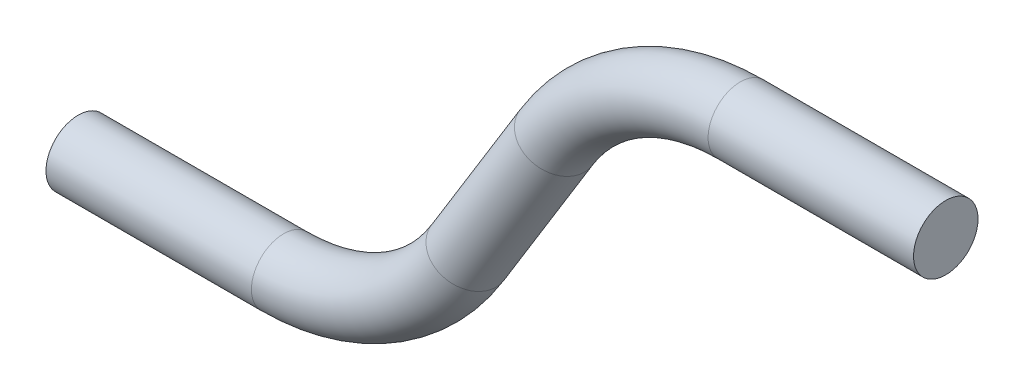
ISO-10303-21;
HEADER;
FILE_DESCRIPTION(('STEP AP214'),'2;1');
FILE_NAME('part.step','',(''),(''),'','','');
FILE_SCHEMA(('AUTOMOTIVE_DESIGN { 1 0 10303 214 1 1 1 1 }'));
ENDSEC;
DATA;
#1=APPLICATION_CONTEXT('core data for automotive mechanical design processes');
#2=APPLICATION_PROTOCOL_DEFINITION('international standard','automotive_design',2000,#1);
#3=PRODUCT_CONTEXT('',#1,'mechanical');
#4=PRODUCT('Part','Part','',(#3));
#5=PRODUCT_RELATED_PRODUCT_CATEGORY('part','',(#4));
#6=PRODUCT_DEFINITION_FORMATION('','',#4);
#7=PRODUCT_DEFINITION_CONTEXT('part definition',#1,'design');
#8=PRODUCT_DEFINITION('design','',#6,#7);
#9=PRODUCT_DEFINITION_SHAPE('','',#8);
#10=(LENGTH_UNIT() NAMED_UNIT(*) SI_UNIT(.MILLI.,.METRE.));
#11=(NAMED_UNIT(*) PLANE_ANGLE_UNIT() SI_UNIT($,.RADIAN.));
#12=(NAMED_UNIT(*) SI_UNIT($,.STERADIAN.) SOLID_ANGLE_UNIT());
#13=UNCERTAINTY_MEASURE_WITH_UNIT(LENGTH_MEASURE(1.E-05),#10,'distance_accuracy_value','');
#14=(GEOMETRIC_REPRESENTATION_CONTEXT(3) GLOBAL_UNCERTAINTY_ASSIGNED_CONTEXT((#13)) GLOBAL_UNIT_ASSIGNED_CONTEXT((#10,
#11,#12)) REPRESENTATION_CONTEXT('',''));
#15=CARTESIAN_POINT('',(0.,0.,0.));
#16=DIRECTION('',(0.,0.,1.));
#17=DIRECTION('',(1.,0.,0.));
#18=AXIS2_PLACEMENT_3D('',#15,#16,#17);
#19=CARTESIAN_POINT('',(-123.043127582043,35.,-68.9999999999999));
#20=DIRECTION('',(1.,0.,0.));
#21=DIRECTION('',(0.,0.,-1.));
#22=AXIS2_PLACEMENT_3D('',#19,#20,#21);
#23=PLANE('',#22);
#24=CARTESIAN_POINT('',(-123.043127582043,35.,-68.9999999999999));
#25=DIRECTION('',(1.,0.,0.));
#26=DIRECTION('',(0.,0.,-1.));
#27=AXIS2_PLACEMENT_3D('',#24,#25,#26);
#28=CIRCLE('',#27,2.15);
#29=CARTESIAN_POINT('',(-123.043127582043,35.,-71.1499999999999));
#30=VERTEX_POINT('',#29);
#31=EDGE_CURVE('E44',#30,#30,#28,.T.);
#32=ORIENTED_EDGE('',*,*,#31,.T.);
#33=EDGE_LOOP('',(#32));
#34=FACE_BOUND('',#33,.T.);
#35=ADVANCED_FACE('F32',(#34),#23,.T.);
#36=CARTESIAN_POINT('',(-179.4,12.5,-67.5));
#37=DIRECTION('',(1.,0.,0.));
#38=DIRECTION('',(0.,0.,-1.));
#39=AXIS2_PLACEMENT_3D('',#36,#37,#38);
#40=PLANE('',#39);
#41=CARTESIAN_POINT('',(-179.4,12.5,-67.5));
#42=DIRECTION('',(1.,0.,0.));
#43=DIRECTION('',(0.,0.,-1.));
#44=AXIS2_PLACEMENT_3D('',#41,#42,#43);
#45=CIRCLE('',#44,2.15);
#46=CARTESIAN_POINT('',(-179.4,12.5,-69.65));
#47=VERTEX_POINT('',#46);
#48=EDGE_CURVE('E11',#47,#47,#45,.T.);
#49=ORIENTED_EDGE('',*,*,#48,.F.);
#50=EDGE_LOOP('',(#49));
#51=FACE_BOUND('',#50,.T.);
#52=ADVANCED_FACE('F50',(#51),#40,.F.);
#53=CARTESIAN_POINT('',(-123.043127582043,35.,-68.9999999999999));
#54=DIRECTION('',(-1.,0.,0.));
#55=DIRECTION('',(0.,0.,1.));
#56=AXIS2_PLACEMENT_3D('',#53,#54,#55);
#57=CYLINDRICAL_SURFACE('',#56,2.15);
#58=CARTESIAN_POINT('',(-136.743127582043,35.,-68.9999999999999));
#59=DIRECTION('',(1.,0.,0.));
#60=DIRECTION('',(0.,0.,-1.));
#61=AXIS2_PLACEMENT_3D('',#58,#59,#60);
#62=CIRCLE('',#61,2.15);
#63=CARTESIAN_POINT('',(-136.743127582043,37.1452380893917,-69.1430158726261));
#64=VERTEX_POINT('',#63);
#65=EDGE_CURVE('E84',#64,#64,#62,.T.);
#66=ORIENTED_EDGE('',*,*,#65,.T.);
#67=EDGE_LOOP('',(#66));
#68=FACE_BOUND('',#67,.T.);
#69=ORIENTED_EDGE('',*,*,#31,.F.);
#70=EDGE_LOOP('',(#69));
#71=FACE_BOUND('',#70,.T.);
#72=ADVANCED_FACE('F52',(#68,#71),#57,.T.);
#73=CARTESIAN_POINT('',(-136.743127582043,21.3093535275131,-68.0872902351675));
#74=DIRECTION('',(0.,0.0665190105237734,0.997785157856609));
#75=DIRECTION('',(0.,-0.997785157856609,0.0665190105237734));
#76=AXIS2_PLACEMENT_3D('',#73,#74,#75);
#77=TOROIDAL_SURFACE('',#76,13.7210364021614,2.15);
#78=CARTESIAN_POINT('',(-148.571584155789,28.2476888658211,-68.5498459243881));
#79=DIRECTION('',(0.506793842953401,0.860157940239558,-0.0573438626826367));
#80=DIRECTION('',(-0.0573438626826367,-0.0327349219278714,-0.997817671871476));
#81=AXIS2_PLACEMENT_3D('',#78,#79,#80);
#82=CIRCLE('',#81,2.15);
#83=CARTESIAN_POINT('',(-150.425028814645,29.3348823211939,-68.6223254880796));
#84=VERTEX_POINT('',#83);
#85=EDGE_CURVE('E81',#84,#84,#82,.T.);
#86=CARTESIAN_POINT('',(-136.743127582043,21.3093535275131,-68.0872902351675));
#87=DIRECTION('',(0.,0.0665190105237734,0.997785157856609));
#88=DIRECTION('',(0.,-0.997785157856609,0.0665190105237734));
#89=AXIS2_PLACEMENT_3D('',#86,#87,#88);
#90=CIRCLE('',#89,15.8710364021614);
#91=EDGE_CURVE('',#64,#84,#90,.T.);
#92=ORIENTED_EDGE('',*,*,#65,.F.);
#93=ORIENTED_EDGE('',*,*,#85,.T.);
#94=ORIENTED_EDGE('',*,*,#91,.T.);
#95=ORIENTED_EDGE('',*,*,#91,.F.);
#96=EDGE_LOOP('',(#92,#94,#93,#95));
#97=FACE_BOUND('',#96,.T.);
#98=ADVANCED_FACE('F57',(#97),#77,.T.);
#99=CARTESIAN_POINT('',(-148.571584155789,28.2476888658211,-68.5498459243881));
#100=DIRECTION('',(-0.506793842953402,-0.860157940239557,0.0573438626826363));
#101=DIRECTION('',(0.861575674341792,-0.507629153400873,0.));
#102=AXIS2_PLACEMENT_3D('',#99,#100,#101);
#103=CYLINDRICAL_SURFACE('',#102,2.15);
#104=CARTESIAN_POINT('',(-153.871543426254,19.2523111341788,-67.9501540756119));
#105=DIRECTION('',(0.506793842953402,0.860157940239557,-0.0573438626826363));
#106=DIRECTION('',(-0.0573438626826365,-0.032734921927871,-0.997817671871476));
#107=AXIS2_PLACEMENT_3D('',#104,#105,#106);
#108=CIRCLE('',#107,2.15);
#109=CARTESIAN_POINT('',(-152.018098767398,18.165117678806,-67.8776745119204));
#110=VERTEX_POINT('',#109);
#111=EDGE_CURVE('E86',#110,#110,#108,.T.);
#112=ORIENTED_EDGE('',*,*,#111,.T.);
#113=EDGE_LOOP('',(#112));
#114=FACE_BOUND('',#113,.T.);
#115=ORIENTED_EDGE('',*,*,#85,.F.);
#116=EDGE_LOOP('',(#115));
#117=FACE_BOUND('',#116,.T.);
#118=ADVANCED_FACE('F67',(#114,#117),#103,.T.);
#119=CARTESIAN_POINT('',(-165.7,26.1906464724869,-68.4127097648325));
#120=DIRECTION('',(0.,-0.0665190105237734,-0.997785157856609));
#121=DIRECTION('',(0.,0.997785157856609,-0.0665190105237734));
#122=AXIS2_PLACEMENT_3D('',#119,#120,#121);
#123=TOROIDAL_SURFACE('',#122,13.7210364021614,2.15);
#124=CARTESIAN_POINT('',(-165.7,12.5,-67.5));
#125=DIRECTION('',(1.,0.,0.));
#126=DIRECTION('',(0.,0.,-1.));
#127=AXIS2_PLACEMENT_3D('',#124,#125,#126);
#128=CIRCLE('',#127,2.15);
#129=CARTESIAN_POINT('',(-165.7,10.3547619106083,-67.3569841273739));
#130=VERTEX_POINT('',#129);
#131=EDGE_CURVE('E39',#130,#130,#128,.T.);
#132=CARTESIAN_POINT('',(-165.7,26.1906464724869,-68.4127097648325));
#133=DIRECTION('',(0.,-0.0665190105237734,-0.997785157856609));
#134=DIRECTION('',(0.,0.997785157856609,-0.0665190105237734));
#135=AXIS2_PLACEMENT_3D('',#132,#133,#134);
#136=CIRCLE('',#135,15.8710364021614);
#137=EDGE_CURVE('',#110,#130,#136,.T.);
#138=ORIENTED_EDGE('',*,*,#111,.F.);
#139=ORIENTED_EDGE('',*,*,#131,.T.);
#140=ORIENTED_EDGE('',*,*,#137,.T.);
#141=ORIENTED_EDGE('',*,*,#137,.F.);
#142=EDGE_LOOP('',(#138,#140,#139,#141));
#143=FACE_BOUND('',#142,.T.);
#144=ADVANCED_FACE('F63',(#143),#123,.T.);
#145=CARTESIAN_POINT('',(-165.7,12.5,-67.5));
#146=DIRECTION('',(-1.,0.,0.));
#147=DIRECTION('',(0.,0.,1.));
#148=AXIS2_PLACEMENT_3D('',#145,#146,#147);
#149=CYLINDRICAL_SURFACE('',#148,2.15);
#150=ORIENTED_EDGE('',*,*,#48,.T.);
#151=EDGE_LOOP('',(#150));
#152=FACE_BOUND('',#151,.T.);
#153=ORIENTED_EDGE('',*,*,#131,.F.);
#154=EDGE_LOOP('',(#153));
#155=FACE_BOUND('',#154,.T.);
#156=ADVANCED_FACE('F47',(#152,#155),#149,.T.);
#157=CLOSED_SHELL('',(#35,#52,#72,#98,#118,#144,#156));
#158=MANIFOLD_SOLID_BREP('B2',#157);
#159=ADVANCED_BREP_SHAPE_REPRESENTATION('',(#18,#158),#14);
#160=SHAPE_DEFINITION_REPRESENTATION(#9,#159);
ENDSEC;
END-ISO-10303-21;
